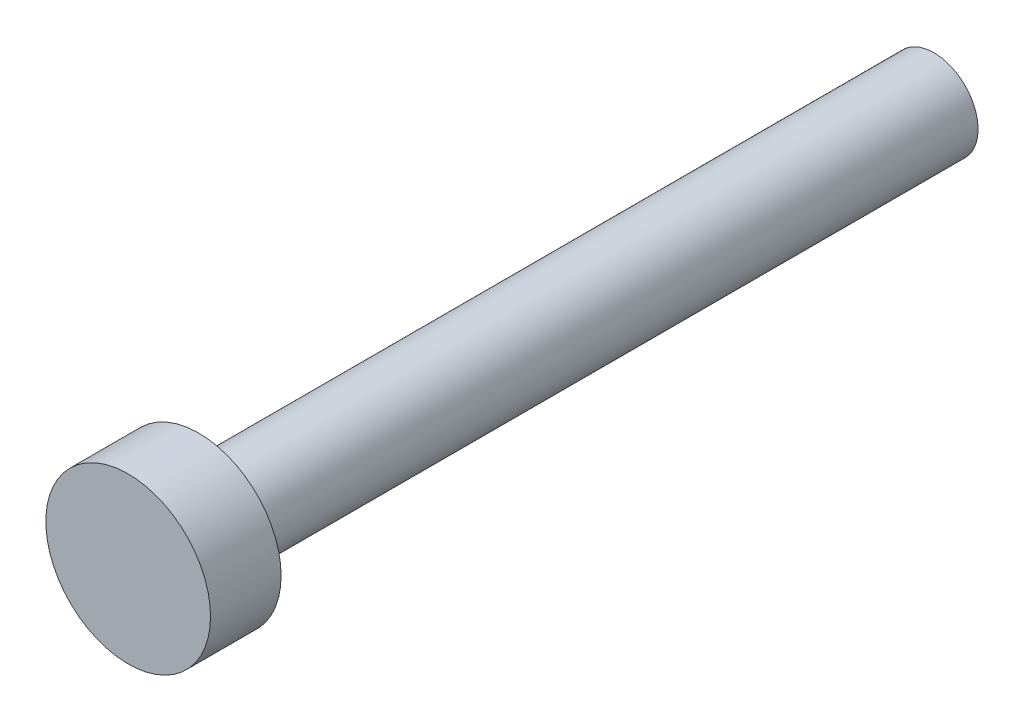
ISO-10303-21;
HEADER;
FILE_DESCRIPTION(('STEP AP214'),'2;1');
FILE_NAME('part.step','',(''),(''),'','','');
FILE_SCHEMA(('AUTOMOTIVE_DESIGN { 1 0 10303 214 1 1 1 1 }'));
ENDSEC;
DATA;
#1=APPLICATION_CONTEXT('core data for automotive mechanical design processes');
#2=APPLICATION_PROTOCOL_DEFINITION('international standard','automotive_design',2000,#1);
#3=PRODUCT_CONTEXT('',#1,'mechanical');
#4=PRODUCT('Part','Part','',(#3));
#5=PRODUCT_RELATED_PRODUCT_CATEGORY('part','',(#4));
#6=PRODUCT_DEFINITION_FORMATION('','',#4);
#7=PRODUCT_DEFINITION_CONTEXT('part definition',#1,'design');
#8=PRODUCT_DEFINITION('design','',#6,#7);
#9=PRODUCT_DEFINITION_SHAPE('','',#8);
#10=(LENGTH_UNIT() NAMED_UNIT(*) SI_UNIT(.MILLI.,.METRE.));
#11=(NAMED_UNIT(*) PLANE_ANGLE_UNIT() SI_UNIT($,.RADIAN.));
#12=(NAMED_UNIT(*) SI_UNIT($,.STERADIAN.) SOLID_ANGLE_UNIT());
#13=UNCERTAINTY_MEASURE_WITH_UNIT(LENGTH_MEASURE(1.E-05),#10,'distance_accuracy_value','');
#14=(GEOMETRIC_REPRESENTATION_CONTEXT(3) GLOBAL_UNCERTAINTY_ASSIGNED_CONTEXT((#13)) GLOBAL_UNIT_ASSIGNED_CONTEXT((#10,
#11,#12)) REPRESENTATION_CONTEXT('',''));
#15=CARTESIAN_POINT('',(0.,0.,0.));
#16=DIRECTION('',(0.,0.,1.));
#17=DIRECTION('',(1.,0.,0.));
#18=AXIS2_PLACEMENT_3D('',#15,#16,#17);
#19=CARTESIAN_POINT('',(0.,0.,2.4));
#20=DIRECTION('',(0.,0.,-1.));
#21=DIRECTION('',(-1.,0.,0.));
#22=AXIS2_PLACEMENT_3D('',#19,#20,#21);
#23=CYLINDRICAL_SURFACE('',#22,2.8);
#24=CARTESIAN_POINT('',(0.,0.,2.4));
#25=DIRECTION('',(0.,0.,1.));
#26=DIRECTION('',(1.,0.,0.));
#27=AXIS2_PLACEMENT_3D('',#24,#25,#26);
#28=CIRCLE('',#27,2.8);
#29=CARTESIAN_POINT('',(2.8,0.,2.4));
#30=VERTEX_POINT('',#29);
#31=EDGE_CURVE('E37',#30,#30,#28,.T.);
#32=ORIENTED_EDGE('',*,*,#31,.F.);
#33=EDGE_LOOP('',(#32));
#34=FACE_BOUND('',#33,.T.);
#35=CARTESIAN_POINT('',(0.,0.,0.));
#36=DIRECTION('',(0.,0.,1.));
#37=DIRECTION('',(1.,0.,0.));
#38=AXIS2_PLACEMENT_3D('',#35,#36,#37);
#39=CIRCLE('',#38,2.8);
#40=CARTESIAN_POINT('',(2.8,0.,0.));
#41=VERTEX_POINT('',#40);
#42=EDGE_CURVE('E33',#41,#41,#39,.T.);
#43=ORIENTED_EDGE('',*,*,#42,.T.);
#44=EDGE_LOOP('',(#43));
#45=FACE_BOUND('',#44,.T.);
#46=ADVANCED_FACE('F30',(#34,#45),#23,.T.);
#47=CARTESIAN_POINT('',(0.,0.,2.4));
#48=DIRECTION('',(0.,0.,1.));
#49=DIRECTION('',(1.,0.,0.));
#50=AXIS2_PLACEMENT_3D('',#47,#48,#49);
#51=PLANE('',#50);
#52=ORIENTED_EDGE('',*,*,#31,.T.);
#53=EDGE_LOOP('',(#52));
#54=FACE_BOUND('',#53,.T.);
#55=ADVANCED_FACE('F54',(#54),#51,.T.);
#56=CARTESIAN_POINT('',(0.,0.,0.));
#57=DIRECTION('',(0.,0.,1.));
#58=DIRECTION('',(1.,0.,0.));
#59=AXIS2_PLACEMENT_3D('',#56,#57,#58);
#60=PLANE('',#59);
#61=CARTESIAN_POINT('',(0.,0.,0.));
#62=DIRECTION('',(0.,0.,-1.));
#63=DIRECTION('',(-1.,0.,0.));
#64=AXIS2_PLACEMENT_3D('',#61,#62,#63);
#65=CIRCLE('',#64,1.5);
#66=CARTESIAN_POINT('',(-1.5,0.,0.));
#67=VERTEX_POINT('',#66);
#68=EDGE_CURVE('E10',#67,#67,#65,.T.);
#69=ORIENTED_EDGE('',*,*,#68,.F.);
#70=EDGE_LOOP('',(#69));
#71=FACE_BOUND('',#70,.T.);
#72=ORIENTED_EDGE('',*,*,#42,.F.);
#73=EDGE_LOOP('',(#72));
#74=FACE_BOUND('',#73,.T.);
#75=ADVANCED_FACE('F51',(#71,#74),#60,.F.);
#76=CARTESIAN_POINT('',(0.,0.,-25.));
#77=DIRECTION('',(0.,0.,1.));
#78=DIRECTION('',(1.,0.,0.));
#79=AXIS2_PLACEMENT_3D('',#76,#77,#78);
#80=CYLINDRICAL_SURFACE('',#79,1.5);
#81=CARTESIAN_POINT('',(0.,0.,-25.));
#82=DIRECTION('',(0.,0.,-1.));
#83=DIRECTION('',(-1.,0.,0.));
#84=AXIS2_PLACEMENT_3D('',#81,#82,#83);
#85=CIRCLE('',#84,1.5);
#86=CARTESIAN_POINT('',(-1.5,0.,-25.));
#87=VERTEX_POINT('',#86);
#88=EDGE_CURVE('E43',#87,#87,#85,.T.);
#89=ORIENTED_EDGE('',*,*,#88,.F.);
#90=EDGE_LOOP('',(#89));
#91=FACE_BOUND('',#90,.T.);
#92=ORIENTED_EDGE('',*,*,#68,.T.);
#93=EDGE_LOOP('',(#92));
#94=FACE_BOUND('',#93,.T.);
#95=ADVANCED_FACE('F53',(#91,#94),#80,.T.);
#96=CARTESIAN_POINT('',(0.,0.,-25.));
#97=DIRECTION('',(0.,0.,-1.));
#98=DIRECTION('',(-1.,0.,0.));
#99=AXIS2_PLACEMENT_3D('',#96,#97,#98);
#100=PLANE('',#99);
#101=ORIENTED_EDGE('',*,*,#88,.T.);
#102=EDGE_LOOP('',(#101));
#103=FACE_BOUND('',#102,.T.);
#104=ADVANCED_FACE('F60',(#103),#100,.T.);
#105=CLOSED_SHELL('',(#46,#55,#75,#95,#104));
#106=MANIFOLD_SOLID_BREP('B2',#105);
#107=ADVANCED_BREP_SHAPE_REPRESENTATION('',(#18,#106),#14);
#108=SHAPE_DEFINITION_REPRESENTATION(#9,#107);
ENDSEC;
END-ISO-10303-21;
